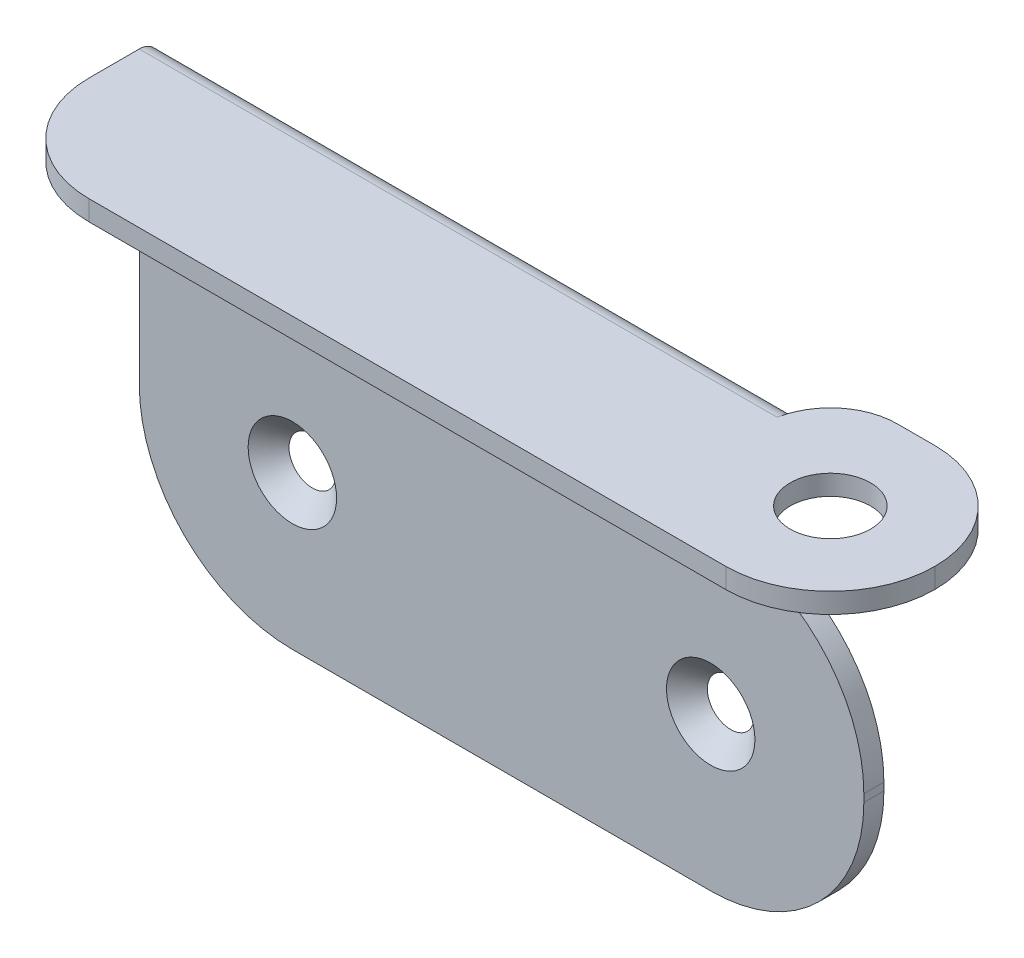
ISO-10303-21;
HEADER;
FILE_DESCRIPTION(('STEP AP214'),'2;1');
FILE_NAME('part.step','',(''),(''),'','','');
FILE_SCHEMA(('AUTOMOTIVE_DESIGN { 1 0 10303 214 1 1 1 1 }'));
ENDSEC;
DATA;
#1=APPLICATION_CONTEXT('core data for automotive mechanical design processes');
#2=APPLICATION_PROTOCOL_DEFINITION('international standard','automotive_design',2000,#1);
#3=PRODUCT_CONTEXT('',#1,'mechanical');
#4=PRODUCT('Part','Part','',(#3));
#5=PRODUCT_RELATED_PRODUCT_CATEGORY('part','',(#4));
#6=PRODUCT_DEFINITION_FORMATION('','',#4);
#7=PRODUCT_DEFINITION_CONTEXT('part definition',#1,'design');
#8=PRODUCT_DEFINITION('design','',#6,#7);
#9=PRODUCT_DEFINITION_SHAPE('','',#8);
#10=(LENGTH_UNIT() NAMED_UNIT(*) SI_UNIT(.MILLI.,.METRE.));
#11=(NAMED_UNIT(*) PLANE_ANGLE_UNIT() SI_UNIT($,.RADIAN.));
#12=(NAMED_UNIT(*) SI_UNIT($,.STERADIAN.) SOLID_ANGLE_UNIT());
#13=UNCERTAINTY_MEASURE_WITH_UNIT(LENGTH_MEASURE(1.E-05),#10,'distance_accuracy_value','');
#14=(GEOMETRIC_REPRESENTATION_CONTEXT(3) GLOBAL_UNCERTAINTY_ASSIGNED_CONTEXT((#13)) GLOBAL_UNIT_ASSIGNED_CONTEXT((#10,
#11,#12)) REPRESENTATION_CONTEXT('',''));
#15=CARTESIAN_POINT('',(0.,0.,0.));
#16=DIRECTION('',(0.,0.,1.));
#17=DIRECTION('',(1.,0.,0.));
#18=AXIS2_PLACEMENT_3D('',#15,#16,#17);
#19=CARTESIAN_POINT('',(0.,0.,0.));
#20=DIRECTION('',(0.,0.,1.));
#21=DIRECTION('',(1.,0.,0.));
#22=AXIS2_PLACEMENT_3D('',#19,#20,#21);
#23=PLANE('',#22);
#24=CARTESIAN_POINT('',(-15.875,0.,0.));
#25=DIRECTION('',(0.,0.,-1.));
#26=DIRECTION('',(-1.,0.,0.));
#27=AXIS2_PLACEMENT_3D('',#24,#25,#26);
#28=CIRCLE('',#27,1.778);
#29=CARTESIAN_POINT('',(-17.653,0.,0.));
#30=VERTEX_POINT('',#29);
#31=EDGE_CURVE('E406',#30,#30,#28,.T.);
#32=ORIENTED_EDGE('',*,*,#31,.F.);
#33=EDGE_LOOP('',(#32));
#34=FACE_BOUND('',#33,.T.);
#35=CARTESIAN_POINT('',(15.875,0.,0.));
#36=DIRECTION('',(0.,0.,-1.));
#37=DIRECTION('',(-1.,0.,0.));
#38=AXIS2_PLACEMENT_3D('',#35,#36,#37);
#39=CIRCLE('',#38,1.778);
#40=CARTESIAN_POINT('',(14.097,0.,0.));
#41=VERTEX_POINT('',#40);
#42=EDGE_CURVE('E413',#41,#41,#39,.T.);
#43=ORIENTED_EDGE('',*,*,#42,.F.);
#44=EDGE_LOOP('',(#43));
#45=FACE_BOUND('',#44,.T.);
#46=DIRECTION('',(0.,-1.,0.));
#47=VECTOR('',#46,1.);
#48=CARTESIAN_POINT('',(-27.4955,7.42949999999999,0.));
#49=LINE('',#48,#47);
#50=CARTESIAN_POINT('',(-27.4955,20.5105,0.));
#51=VERTEX_POINT('',#50);
#52=CARTESIAN_POINT('',(-27.4955,0.,0.));
#53=VERTEX_POINT('',#52);
#54=EDGE_CURVE('E212',#51,#53,#49,.T.);
#55=ORIENTED_EDGE('',*,*,#54,.F.);
#56=DIRECTION('',(-1.,0.,0.));
#57=VECTOR('',#56,1.);
#58=CARTESIAN_POINT('',(0.,20.5105,0.));
#59=LINE('',#58,#57);
#60=CARTESIAN_POINT('',(19.8755,20.5105,0.));
#61=VERTEX_POINT('',#60);
#62=EDGE_CURVE('E373',#51,#61,#59,.F.);
#63=ORIENTED_EDGE('',*,*,#62,.T.);
#64=CARTESIAN_POINT('',(19.8755,17.9705,0.));
#65=DIRECTION('',(0.,0.,-1.));
#66=DIRECTION('',(-1.,0.,0.));
#67=AXIS2_PLACEMENT_3D('',#64,#65,#66);
#68=CIRCLE('',#67,2.54);
#69=CARTESIAN_POINT('',(17.3355,17.9705,0.));
#70=VERTEX_POINT('',#69);
#71=EDGE_CURVE('E187',#70,#61,#68,.T.);
#72=ORIENTED_EDGE('',*,*,#71,.F.);
#73=DIRECTION('',(0.,1.,0.));
#74=VECTOR('',#73,1.);
#75=CARTESIAN_POINT('',(17.3355,14.1605,0.));
#76=LINE('',#75,#74);
#77=CARTESIAN_POINT('',(17.3355,14.1605,0.));
#78=VERTEX_POINT('',#77);
#79=EDGE_CURVE('E173',#78,#70,#76,.T.);
#80=ORIENTED_EDGE('',*,*,#79,.F.);
#81=CARTESIAN_POINT('',(19.8755,14.1605,0.));
#82=DIRECTION('',(0.,0.,-1.));
#83=DIRECTION('',(-1.,0.,0.));
#84=AXIS2_PLACEMENT_3D('',#81,#82,#83);
#85=CIRCLE('',#84,2.54);
#86=CARTESIAN_POINT('',(19.1579215246637,11.7239694478144,0.));
#87=VERTEX_POINT('',#86);
#88=EDGE_CURVE('E163',#87,#78,#85,.T.);
#89=ORIENTED_EDGE('',*,*,#88,.F.);
#90=CARTESIAN_POINT('',(15.875,0.576842171565131,0.));
#91=DIRECTION('',(0.,0.,1.));
#92=DIRECTION('',(1.,0.,0.));
#93=AXIS2_PLACEMENT_3D('',#90,#91,#92);
#94=CIRCLE('',#93,11.6205);
#95=CARTESIAN_POINT('',(27.4955,0.576842171565131,0.));
#96=VERTEX_POINT('',#95);
#97=EDGE_CURVE('E255',#87,#96,#94,.F.);
#98=ORIENTED_EDGE('',*,*,#97,.T.);
#99=DIRECTION('',(0.,1.,0.));
#100=VECTOR('',#99,1.);
#101=CARTESIAN_POINT('',(27.4955,11.6205,0.));
#102=LINE('',#101,#100);
#103=CARTESIAN_POINT('',(27.4955,0.,0.));
#104=VERTEX_POINT('',#103);
#105=EDGE_CURVE('E216',#104,#96,#102,.T.);
#106=ORIENTED_EDGE('',*,*,#105,.F.);
#107=CARTESIAN_POINT('',(15.875,0.,0.));
#108=DIRECTION('',(0.,0.,1.));
#109=DIRECTION('',(1.,0.,0.));
#110=AXIS2_PLACEMENT_3D('',#107,#108,#109);
#111=CIRCLE('',#110,11.6205);
#112=CARTESIAN_POINT('',(15.875,-11.6205,0.));
#113=VERTEX_POINT('',#112);
#114=EDGE_CURVE('E244',#104,#113,#111,.F.);
#115=ORIENTED_EDGE('',*,*,#114,.T.);
#116=DIRECTION('',(1.,0.,0.));
#117=VECTOR('',#116,1.);
#118=CARTESIAN_POINT('',(-27.4955,-11.6205,0.));
#119=LINE('',#118,#117);
#120=CARTESIAN_POINT('',(-15.875,-11.6205,0.));
#121=VERTEX_POINT('',#120);
#122=EDGE_CURVE('E223',#121,#113,#119,.T.);
#123=ORIENTED_EDGE('',*,*,#122,.F.);
#124=CARTESIAN_POINT('',(-15.875,0.,0.));
#125=DIRECTION('',(0.,0.,1.));
#126=DIRECTION('',(1.,0.,0.));
#127=AXIS2_PLACEMENT_3D('',#124,#125,#126);
#128=CIRCLE('',#127,11.6205);
#129=EDGE_CURVE('E257',#121,#53,#128,.F.);
#130=ORIENTED_EDGE('',*,*,#129,.T.);
#131=EDGE_LOOP('',(#55,#63,#72,#80,#89,#98,#106,#115,#123,#130));
#132=FACE_BOUND('',#131,.T.);
#133=ADVANCED_FACE('F33',(#34,#45,#132),#23,.F.);
#134=CARTESIAN_POINT('',(0.,0.,1.524));
#135=DIRECTION('',(0.,0.,1.));
#136=DIRECTION('',(1.,0.,0.));
#137=AXIS2_PLACEMENT_3D('',#134,#135,#136);
#138=PLANE('',#137);
#139=CARTESIAN_POINT('',(15.875,0.,1.524));
#140=DIRECTION('',(0.,0.,1.));
#141=DIRECTION('',(1.,0.,0.));
#142=AXIS2_PLACEMENT_3D('',#139,#140,#141);
#143=CIRCLE('',#142,3.35614819821684);
#144=CARTESIAN_POINT('',(19.2311481982168,0.,1.524));
#145=VERTEX_POINT('',#144);
#146=EDGE_CURVE('E421',#145,#145,#143,.T.);
#147=ORIENTED_EDGE('',*,*,#146,.F.);
#148=EDGE_LOOP('',(#147));
#149=FACE_BOUND('',#148,.T.);
#150=CARTESIAN_POINT('',(-15.875,0.,1.524));
#151=DIRECTION('',(0.,0.,1.));
#152=DIRECTION('',(1.,0.,0.));
#153=AXIS2_PLACEMENT_3D('',#150,#151,#152);
#154=CIRCLE('',#153,3.35614819821683);
#155=CARTESIAN_POINT('',(-12.5188518017832,0.,1.524));
#156=VERTEX_POINT('',#155);
#157=EDGE_CURVE('E416',#156,#156,#154,.T.);
#158=ORIENTED_EDGE('',*,*,#157,.F.);
#159=EDGE_LOOP('',(#158));
#160=FACE_BOUND('',#159,.T.);
#161=CARTESIAN_POINT('',(19.8755,17.9705,1.524));
#162=DIRECTION('',(0.,0.,1.));
#163=DIRECTION('',(1.,0.,0.));
#164=AXIS2_PLACEMENT_3D('',#161,#162,#163);
#165=CIRCLE('',#164,2.54);
#166=CARTESIAN_POINT('',(17.5475515469624,18.9865,1.524));
#167=VERTEX_POINT('',#166);
#168=CARTESIAN_POINT('',(17.3355,17.9705,1.524));
#169=VERTEX_POINT('',#168);
#170=EDGE_CURVE('E195',#167,#169,#165,.T.);
#171=ORIENTED_EDGE('',*,*,#170,.F.);
#172=DIRECTION('',(1.,0.,0.));
#173=VECTOR('',#172,1.);
#174=CARTESIAN_POINT('',(0.,18.9865,1.524));
#175=LINE('',#174,#173);
#176=CARTESIAN_POINT('',(-27.4955,18.9865,1.524));
#177=VERTEX_POINT('',#176);
#178=EDGE_CURVE('E273',#167,#177,#175,.F.);
#179=ORIENTED_EDGE('',*,*,#178,.T.);
#180=DIRECTION('',(0.,-1.,0.));
#181=VECTOR('',#180,1.);
#182=CARTESIAN_POINT('',(-27.4955,22.0345,1.524));
#183=LINE('',#182,#181);
#184=CARTESIAN_POINT('',(-27.4955,0.,1.524));
#185=VERTEX_POINT('',#184);
#186=EDGE_CURVE('E213',#177,#185,#183,.T.);
#187=ORIENTED_EDGE('',*,*,#186,.T.);
#188=CARTESIAN_POINT('',(-15.875,0.,1.524));
#189=DIRECTION('',(0.,0.,1.));
#190=DIRECTION('',(1.,0.,0.));
#191=AXIS2_PLACEMENT_3D('',#188,#189,#190);
#192=CIRCLE('',#191,11.6205);
#193=CARTESIAN_POINT('',(-15.875,-11.6205,1.524));
#194=VERTEX_POINT('',#193);
#195=EDGE_CURVE('E265',#185,#194,#192,.T.);
#196=ORIENTED_EDGE('',*,*,#195,.T.);
#197=DIRECTION('',(1.,0.,0.));
#198=VECTOR('',#197,1.);
#199=CARTESIAN_POINT('',(-27.4955,-11.6205,1.524));
#200=LINE('',#199,#198);
#201=CARTESIAN_POINT('',(15.875,-11.6205,1.524));
#202=VERTEX_POINT('',#201);
#203=EDGE_CURVE('E215',#194,#202,#200,.T.);
#204=ORIENTED_EDGE('',*,*,#203,.T.);
#205=CARTESIAN_POINT('',(15.875,0.,1.524));
#206=DIRECTION('',(0.,0.,1.));
#207=DIRECTION('',(1.,0.,0.));
#208=AXIS2_PLACEMENT_3D('',#205,#206,#207);
#209=CIRCLE('',#208,11.6205);
#210=CARTESIAN_POINT('',(27.4955,0.,1.524));
#211=VERTEX_POINT('',#210);
#212=EDGE_CURVE('E250',#202,#211,#209,.T.);
#213=ORIENTED_EDGE('',*,*,#212,.T.);
#214=DIRECTION('',(0.,1.,0.));
#215=VECTOR('',#214,1.);
#216=CARTESIAN_POINT('',(27.4955,11.6205,1.524));
#217=LINE('',#216,#215);
#218=CARTESIAN_POINT('',(27.4955,0.576842171565131,1.524));
#219=VERTEX_POINT('',#218);
#220=EDGE_CURVE('E218',#211,#219,#217,.T.);
#221=ORIENTED_EDGE('',*,*,#220,.T.);
#222=CARTESIAN_POINT('',(15.875,0.576842171565131,1.524));
#223=DIRECTION('',(0.,0.,1.));
#224=DIRECTION('',(1.,0.,0.));
#225=AXIS2_PLACEMENT_3D('',#222,#223,#224);
#226=CIRCLE('',#225,11.6205);
#227=CARTESIAN_POINT('',(19.1579215246637,11.7239694478144,1.524));
#228=VERTEX_POINT('',#227);
#229=EDGE_CURVE('E263',#219,#228,#226,.T.);
#230=ORIENTED_EDGE('',*,*,#229,.T.);
#231=CARTESIAN_POINT('',(19.8755,14.1605,1.524));
#232=DIRECTION('',(0.,0.,1.));
#233=DIRECTION('',(1.,0.,0.));
#234=AXIS2_PLACEMENT_3D('',#231,#232,#233);
#235=CIRCLE('',#234,2.54);
#236=CARTESIAN_POINT('',(17.3355,14.1605,1.524));
#237=VERTEX_POINT('',#236);
#238=EDGE_CURVE('E198',#237,#228,#235,.T.);
#239=ORIENTED_EDGE('',*,*,#238,.F.);
#240=DIRECTION('',(0.,-1.,0.));
#241=VECTOR('',#240,1.);
#242=CARTESIAN_POINT('',(17.3355,0.,1.524));
#243=LINE('',#242,#241);
#244=EDGE_CURVE('E182',#169,#237,#243,.T.);
#245=ORIENTED_EDGE('',*,*,#244,.F.);
#246=EDGE_LOOP('',(#171,#179,#187,#196,#204,#213,#221,#230,#239,#245));
#247=FACE_BOUND('',#246,.T.);
#248=ADVANCED_FACE('F314',(#149,#160,#247),#138,.T.);
#249=CARTESIAN_POINT('',(36.703,22.0345,1.524));
#250=DIRECTION('',(0.,-1.,0.));
#251=DIRECTION('',(1.,0.,0.));
#252=AXIS2_PLACEMENT_3D('',#249,#250,#251);
#253=PLANE('',#252);
#254=CARTESIAN_POINT('',(25.908,22.0345,2.4765));
#255=DIRECTION('',(0.,-1.,0.));
#256=DIRECTION('',(1.,0.,0.));
#257=AXIS2_PLACEMENT_3D('',#254,#255,#256);
#258=CIRCLE('',#257,5.08);
#259=CARTESIAN_POINT('',(25.908,22.0345,-2.6035));
#260=VERTEX_POINT('',#259);
#261=CARTESIAN_POINT('',(20.9180958175532,22.0345,1.524));
#262=VERTEX_POINT('',#261);
#263=EDGE_CURVE('E392',#260,#262,#258,.F.);
#264=ORIENTED_EDGE('',*,*,#263,.T.);
#265=DIRECTION('',(-1.,0.,0.));
#266=VECTOR('',#265,1.);
#267=CARTESIAN_POINT('',(36.703,22.0345,1.524));
#268=LINE('',#267,#266);
#269=CARTESIAN_POINT('',(-27.4955,22.0345,1.524));
#270=VERTEX_POINT('',#269);
#271=EDGE_CURVE('E381',#262,#270,#268,.T.);
#272=ORIENTED_EDGE('',*,*,#271,.T.);
#273=DIRECTION('',(0.,0.,-1.));
#274=VECTOR('',#273,1.);
#275=CARTESIAN_POINT('',(-27.4955,22.0345,1.524));
#276=LINE('',#275,#274);
#277=CARTESIAN_POINT('',(-27.4955,22.0345,5.334));
#278=VERTEX_POINT('',#277);
#279=EDGE_CURVE('E221',#278,#270,#276,.T.);
#280=ORIENTED_EDGE('',*,*,#279,.F.);
#281=CARTESIAN_POINT('',(-19.558,22.0345,5.334));
#282=DIRECTION('',(0.,-1.,0.));
#283=DIRECTION('',(1.,0.,0.));
#284=AXIS2_PLACEMENT_3D('',#281,#282,#283);
#285=CIRCLE('',#284,7.9375);
#286=CARTESIAN_POINT('',(-19.558,22.0345,13.2715));
#287=VERTEX_POINT('',#286);
#288=EDGE_CURVE('E433',#278,#287,#285,.F.);
#289=ORIENTED_EDGE('',*,*,#288,.T.);
#290=DIRECTION('',(-1.,0.,0.));
#291=VECTOR('',#290,1.);
#292=CARTESIAN_POINT('',(36.703,22.0345,13.2715));
#293=LINE('',#292,#291);
#294=CARTESIAN_POINT('',(28.7655,22.0345,13.2715));
#295=VERTEX_POINT('',#294);
#296=EDGE_CURVE('E207',#295,#287,#293,.T.);
#297=ORIENTED_EDGE('',*,*,#296,.F.);
#298=CARTESIAN_POINT('',(28.7655,22.0345,5.334));
#299=DIRECTION('',(0.,-1.,0.));
#300=DIRECTION('',(1.,0.,0.));
#301=AXIS2_PLACEMENT_3D('',#298,#299,#300);
#302=CIRCLE('',#301,7.9375);
#303=CARTESIAN_POINT('',(36.703,22.0345,5.334));
#304=VERTEX_POINT('',#303);
#305=EDGE_CURVE('E232',#295,#304,#302,.F.);
#306=ORIENTED_EDGE('',*,*,#305,.T.);
#307=CARTESIAN_POINT('',(28.7655,22.0345,5.334));
#308=DIRECTION('',(0.,-1.,0.));
#309=DIRECTION('',(1.,0.,0.));
#310=AXIS2_PLACEMENT_3D('',#307,#308,#309);
#311=CIRCLE('',#310,7.9375);
#312=CARTESIAN_POINT('',(28.7655,22.0345,-2.6035));
#313=VERTEX_POINT('',#312);
#314=EDGE_CURVE('E377',#304,#313,#311,.F.);
#315=ORIENTED_EDGE('',*,*,#314,.T.);
#316=DIRECTION('',(-1.,0.,0.));
#317=VECTOR('',#316,1.);
#318=CARTESIAN_POINT('',(36.703,22.0345,-2.6035));
#319=LINE('',#318,#317);
#320=EDGE_CURVE('E407',#313,#260,#319,.T.);
#321=ORIENTED_EDGE('',*,*,#320,.T.);
#322=EDGE_LOOP('',(#264,#272,#280,#289,#297,#306,#315,#321));
#323=FACE_BOUND('',#322,.T.);
#324=CARTESIAN_POINT('',(28.7655,22.0345,5.334));
#325=DIRECTION('',(0.,-1.,0.));
#326=DIRECTION('',(1.,0.,0.));
#327=AXIS2_PLACEMENT_3D('',#324,#325,#326);
#328=CIRCLE('',#327,3.048);
#329=CARTESIAN_POINT('',(31.8135,22.0345,5.334));
#330=VERTEX_POINT('',#329);
#331=EDGE_CURVE('E204',#330,#330,#328,.T.);
#332=ORIENTED_EDGE('',*,*,#331,.T.);
#333=EDGE_LOOP('',(#332));
#334=FACE_BOUND('',#333,.T.);
#335=ADVANCED_FACE('F317',(#323,#334),#253,.F.);
#336=CARTESIAN_POINT('',(-27.4955,7.42949999999999,1.524));
#337=DIRECTION('',(1.,0.,0.));
#338=DIRECTION('',(0.,1.,0.));
#339=AXIS2_PLACEMENT_3D('',#336,#337,#338);
#340=PLANE('',#339);
#341=ORIENTED_EDGE('',*,*,#279,.T.);
#342=CARTESIAN_POINT('',(-27.4955,20.5105,1.524));
#343=DIRECTION('',(1.,0.,0.));
#344=DIRECTION('',(0.,1.,0.));
#345=AXIS2_PLACEMENT_3D('',#342,#343,#344);
#346=CIRCLE('',#345,1.524);
#347=EDGE_CURVE('E371',#270,#51,#346,.F.);
#348=ORIENTED_EDGE('',*,*,#347,.T.);
#349=ORIENTED_EDGE('',*,*,#54,.T.);
#350=DIRECTION('',(0.,0.,-1.));
#351=VECTOR('',#350,1.);
#352=CARTESIAN_POINT('',(-27.4955,0.,1.524));
#353=LINE('',#352,#351);
#354=EDGE_CURVE('E260',#53,#185,#353,.F.);
#355=ORIENTED_EDGE('',*,*,#354,.T.);
#356=ORIENTED_EDGE('',*,*,#186,.F.);
#357=CARTESIAN_POINT('',(-27.4955,18.9865,3.048));
#358=DIRECTION('',(1.,0.,0.));
#359=DIRECTION('',(0.,1.,0.));
#360=AXIS2_PLACEMENT_3D('',#357,#358,#359);
#361=CIRCLE('',#360,1.524);
#362=CARTESIAN_POINT('',(-27.4955,20.5105,3.04800000000002));
#363=VERTEX_POINT('',#362);
#364=EDGE_CURVE('E282',#177,#363,#361,.T.);
#365=ORIENTED_EDGE('',*,*,#364,.T.);
#366=DIRECTION('',(0.,0.,-1.));
#367=VECTOR('',#366,1.);
#368=CARTESIAN_POINT('',(-27.4955,20.5105,58.4457141962647));
#369=LINE('',#368,#367);
#370=CARTESIAN_POINT('',(-27.4955,20.5105,5.33400000000001));
#371=VERTEX_POINT('',#370);
#372=EDGE_CURVE('E174',#371,#363,#369,.T.);
#373=ORIENTED_EDGE('',*,*,#372,.F.);
#374=DIRECTION('',(0.,1.,0.));
#375=VECTOR('',#374,1.);
#376=CARTESIAN_POINT('',(-27.4955,7.42949999999999,5.334));
#377=LINE('',#376,#375);
#378=EDGE_CURVE('E431',#371,#278,#377,.T.);
#379=ORIENTED_EDGE('',*,*,#378,.T.);
#380=EDGE_LOOP('',(#341,#348,#349,#355,#356,#365,#373,#379));
#381=FACE_BOUND('',#380,.T.);
#382=ADVANCED_FACE('F328',(#381),#340,.F.);
#383=CARTESIAN_POINT('',(-27.4955,-11.6205,1.524));
#384=DIRECTION('',(0.,1.,0.));
#385=DIRECTION('',(0.,0.,1.));
#386=AXIS2_PLACEMENT_3D('',#383,#384,#385);
#387=PLANE('',#386);
#388=ORIENTED_EDGE('',*,*,#203,.F.);
#389=DIRECTION('',(0.,0.,-1.));
#390=VECTOR('',#389,1.);
#391=CARTESIAN_POINT('',(-15.875,-11.6205,1.524));
#392=LINE('',#391,#390);
#393=EDGE_CURVE('E252',#194,#121,#392,.T.);
#394=ORIENTED_EDGE('',*,*,#393,.T.);
#395=ORIENTED_EDGE('',*,*,#122,.T.);
#396=DIRECTION('',(0.,0.,-1.));
#397=VECTOR('',#396,1.);
#398=CARTESIAN_POINT('',(15.875,-11.6205,1.524));
#399=LINE('',#398,#397);
#400=EDGE_CURVE('E247',#113,#202,#399,.F.);
#401=ORIENTED_EDGE('',*,*,#400,.T.);
#402=EDGE_LOOP('',(#388,#394,#395,#401));
#403=FACE_BOUND('',#402,.T.);
#404=ADVANCED_FACE('F324',(#403),#387,.F.);
#405=CARTESIAN_POINT('',(27.4955,11.6205,1.524));
#406=DIRECTION('',(-1.,0.,0.));
#407=DIRECTION('',(0.,0.,1.));
#408=AXIS2_PLACEMENT_3D('',#405,#406,#407);
#409=PLANE('',#408);
#410=ORIENTED_EDGE('',*,*,#105,.T.);
#411=DIRECTION('',(0.,0.,-1.));
#412=VECTOR('',#411,1.);
#413=CARTESIAN_POINT('',(27.4955,0.576842171565131,1.524));
#414=LINE('',#413,#412);
#415=EDGE_CURVE('E268',#96,#219,#414,.F.);
#416=ORIENTED_EDGE('',*,*,#415,.T.);
#417=ORIENTED_EDGE('',*,*,#220,.F.);
#418=DIRECTION('',(0.,0.,-1.));
#419=VECTOR('',#418,1.);
#420=CARTESIAN_POINT('',(27.4955,0.,1.524));
#421=LINE('',#420,#419);
#422=EDGE_CURVE('E241',#211,#104,#421,.T.);
#423=ORIENTED_EDGE('',*,*,#422,.T.);
#424=EDGE_LOOP('',(#410,#416,#417,#423));
#425=FACE_BOUND('',#424,.T.);
#426=ADVANCED_FACE('F312',(#425),#409,.F.);
#427=CARTESIAN_POINT('',(36.703,20.5105,13.2715));
#428=DIRECTION('',(0.,1.,0.));
#429=DIRECTION('',(-1.,0.,0.));
#430=AXIS2_PLACEMENT_3D('',#427,#428,#429);
#431=PLANE('',#430);
#432=CARTESIAN_POINT('',(28.7655,20.5105,5.334));
#433=DIRECTION('',(0.,-1.,0.));
#434=DIRECTION('',(1.,0.,0.));
#435=AXIS2_PLACEMENT_3D('',#432,#433,#434);
#436=CIRCLE('',#435,3.048);
#437=CARTESIAN_POINT('',(31.8135,20.5105,5.334));
#438=VERTEX_POINT('',#437);
#439=EDGE_CURVE('E201',#438,#438,#436,.T.);
#440=ORIENTED_EDGE('',*,*,#439,.F.);
#441=EDGE_LOOP('',(#440));
#442=FACE_BOUND('',#441,.T.);
#443=DIRECTION('',(1.,0.,0.));
#444=VECTOR('',#443,1.);
#445=CARTESIAN_POINT('',(19.8755,20.5105,0.));
#446=LINE('',#445,#444);
#447=CARTESIAN_POINT('',(21.4725352272845,20.5105,0.));
#448=VERTEX_POINT('',#447);
#449=EDGE_CURVE('E53',#61,#448,#446,.T.);
#450=ORIENTED_EDGE('',*,*,#449,.T.);
#451=CARTESIAN_POINT('',(25.908,20.5105,2.4765));
#452=DIRECTION('',(0.,1.,0.));
#453=DIRECTION('',(-1.,0.,0.));
#454=AXIS2_PLACEMENT_3D('',#451,#452,#453);
#455=CIRCLE('',#454,5.08);
#456=CARTESIAN_POINT('',(25.908,20.5105,-2.6035));
#457=VERTEX_POINT('',#456);
#458=EDGE_CURVE('E47',#448,#457,#455,.F.);
#459=ORIENTED_EDGE('',*,*,#458,.T.);
#460=DIRECTION('',(1.,0.,0.));
#461=VECTOR('',#460,1.);
#462=CARTESIAN_POINT('',(36.703,20.5105,-2.6035));
#463=LINE('',#462,#461);
#464=CARTESIAN_POINT('',(28.7655,20.5105,-2.6035));
#465=VERTEX_POINT('',#464);
#466=EDGE_CURVE('E396',#457,#465,#463,.T.);
#467=ORIENTED_EDGE('',*,*,#466,.T.);
#468=CARTESIAN_POINT('',(28.7655,20.5105,5.334));
#469=DIRECTION('',(0.,1.,0.));
#470=DIRECTION('',(-1.,0.,0.));
#471=AXIS2_PLACEMENT_3D('',#468,#469,#470);
#472=CIRCLE('',#471,7.9375);
#473=CARTESIAN_POINT('',(36.703,20.5105,5.334));
#474=VERTEX_POINT('',#473);
#475=EDGE_CURVE('E387',#465,#474,#472,.F.);
#476=ORIENTED_EDGE('',*,*,#475,.T.);
#477=CARTESIAN_POINT('',(28.7655,20.5105,5.334));
#478=DIRECTION('',(0.,1.,0.));
#479=DIRECTION('',(-1.,0.,0.));
#480=AXIS2_PLACEMENT_3D('',#477,#478,#479);
#481=CIRCLE('',#480,7.9375);
#482=CARTESIAN_POINT('',(28.7655,20.5105,13.2715));
#483=VERTEX_POINT('',#482);
#484=EDGE_CURVE('E238',#474,#483,#481,.F.);
#485=ORIENTED_EDGE('',*,*,#484,.T.);
#486=DIRECTION('',(1.,0.,0.));
#487=VECTOR('',#486,1.);
#488=CARTESIAN_POINT('',(36.703,20.5105,13.2715));
#489=LINE('',#488,#487);
#490=CARTESIAN_POINT('',(-19.558,20.5105,13.2715));
#491=VERTEX_POINT('',#490);
#492=EDGE_CURVE('E210',#491,#483,#489,.T.);
#493=ORIENTED_EDGE('',*,*,#492,.F.);
#494=CARTESIAN_POINT('',(-19.558,20.5105,5.334));
#495=DIRECTION('',(0.,1.,0.));
#496=DIRECTION('',(-1.,0.,0.));
#497=AXIS2_PLACEMENT_3D('',#494,#495,#496);
#498=CIRCLE('',#497,7.9375);
#499=EDGE_CURVE('E427',#491,#371,#498,.F.);
#500=ORIENTED_EDGE('',*,*,#499,.T.);
#501=ORIENTED_EDGE('',*,*,#372,.T.);
#502=DIRECTION('',(1.,0.,0.));
#503=VECTOR('',#502,1.);
#504=CARTESIAN_POINT('',(36.703,20.5105,3.048));
#505=LINE('',#504,#503);
#506=CARTESIAN_POINT('',(19.8755,20.5105,3.048));
#507=VERTEX_POINT('',#506);
#508=EDGE_CURVE('E270',#363,#507,#505,.T.);
#509=ORIENTED_EDGE('',*,*,#508,.T.);
#510=DIRECTION('',(0.,0.,-1.));
#511=VECTOR('',#510,1.);
#512=CARTESIAN_POINT('',(19.8755,20.5105,13.9446));
#513=LINE('',#512,#511);
#514=EDGE_CURVE('E193',#507,#61,#513,.T.);
#515=ORIENTED_EDGE('',*,*,#514,.T.);
#516=EDGE_LOOP('',(#450,#459,#467,#476,#485,#493,#500,#501,#509,#515));
#517=FACE_BOUND('',#516,.T.);
#518=ADVANCED_FACE('F308',(#442,#517),#431,.F.);
#519=CARTESIAN_POINT('',(0.,0.,13.2715));
#520=DIRECTION('',(0.,0.,-1.));
#521=DIRECTION('',(-1.,0.,0.));
#522=AXIS2_PLACEMENT_3D('',#519,#520,#521);
#523=PLANE('',#522);
#524=ORIENTED_EDGE('',*,*,#296,.T.);
#525=DIRECTION('',(0.,1.,0.));
#526=VECTOR('',#525,1.);
#527=CARTESIAN_POINT('',(-19.558,0.,13.2715));
#528=LINE('',#527,#526);
#529=EDGE_CURVE('E434',#287,#491,#528,.F.);
#530=ORIENTED_EDGE('',*,*,#529,.T.);
#531=ORIENTED_EDGE('',*,*,#492,.T.);
#532=DIRECTION('',(0.,1.,0.));
#533=VECTOR('',#532,1.);
#534=CARTESIAN_POINT('',(28.7655,0.,13.2715));
#535=LINE('',#534,#533);
#536=EDGE_CURVE('E229',#483,#295,#535,.T.);
#537=ORIENTED_EDGE('',*,*,#536,.T.);
#538=EDGE_LOOP('',(#524,#530,#531,#537));
#539=FACE_BOUND('',#538,.T.);
#540=ADVANCED_FACE('F304',(#539),#523,.F.);
#541=CARTESIAN_POINT('',(28.7655,34.4551,5.334));
#542=DIRECTION('',(0.,-1.,0.));
#543=DIRECTION('',(1.,0.,0.));
#544=AXIS2_PLACEMENT_3D('',#541,#542,#543);
#545=CYLINDRICAL_SURFACE('',#544,3.048);
#546=ORIENTED_EDGE('',*,*,#439,.T.);
#547=EDGE_LOOP('',(#546));
#548=FACE_BOUND('',#547,.T.);
#549=ORIENTED_EDGE('',*,*,#331,.F.);
#550=EDGE_LOOP('',(#549));
#551=FACE_BOUND('',#550,.T.);
#552=ADVANCED_FACE('F293',(#548,#551),#545,.F.);
#553=CARTESIAN_POINT('',(19.8755,17.9705,13.9446));
#554=DIRECTION('',(0.,0.,-1.));
#555=DIRECTION('',(-1.,0.,0.));
#556=AXIS2_PLACEMENT_3D('',#553,#554,#555);
#557=CYLINDRICAL_SURFACE('',#556,2.54);
#558=ORIENTED_EDGE('',*,*,#514,.F.);
#559=CARTESIAN_POINT('',(17.5475515469624,18.9865,1.524));
#560=CARTESIAN_POINT('',(17.5672472654258,19.0316560186973,1.52399513726266));
#561=CARTESIAN_POINT('',(17.5882635824378,19.0762009042753,1.52600611045439));
#562=CARTESIAN_POINT('',(17.6326650253971,19.1636799619868,1.53370032251843));
#563=CARTESIAN_POINT('',(17.6560462214487,19.206616648986,1.53937755078635));
#564=CARTESIAN_POINT('',(17.7047216867703,19.2902124424946,1.55397241371087));
#565=CARTESIAN_POINT('',(17.7299940300148,19.3308903015169,1.56285643351122));
#566=CARTESIAN_POINT('',(17.7824234208108,19.4102557621123,1.58352399332433));
#567=CARTESIAN_POINT('',(17.8095814324554,19.4489423277247,1.59530902450307));
#568=CARTESIAN_POINT('',(17.908166900425,19.5814487964071,1.64133837352595));
#569=CARTESIAN_POINT('',(17.9841019026707,19.6696309719166,1.68248005272117));
#570=CARTESIAN_POINT('',(18.143637241959,19.8320405497228,1.77657704561547));
#571=CARTESIAN_POINT('',(18.2272735150868,19.9061970297805,1.82958958669633));
#572=CARTESIAN_POINT('',(18.4340914753251,20.0674746395878,1.96666022709575));
#573=CARTESIAN_POINT('',(18.5597695039215,20.1480185412213,2.05467936445942));
#574=CARTESIAN_POINT('',(18.8170816067228,20.2840634114614,2.24042642209682));
#575=CARTESIAN_POINT('',(18.9487198772019,20.3395464246954,2.33816124239021));
#576=CARTESIAN_POINT('',(19.2110376093122,20.4258051755872,2.53591831848904));
#577=CARTESIAN_POINT('',(19.3416113727465,20.457319196621,2.63576548761217));
#578=CARTESIAN_POINT('',(19.6040114748552,20.4994327681697,2.83771680637285));
#579=CARTESIAN_POINT('',(19.7358347343988,20.5100746256235,2.93981596538622));
#580=CARTESIAN_POINT('',(19.8701875931688,20.5104958275255,3.04388502819377));
#581=CARTESIAN_POINT('',(19.8728438259765,20.5104999937549,3.04594253731352));
#582=CARTESIAN_POINT('',(19.8755,20.5105,3.048));
#583=B_SPLINE_CURVE_WITH_KNOTS('',3,(#559,#560,#561,#562,#563,#564,#565,#566,#567,#568,#569,
#570,#571,#572,#573,#574,#575,#576,#577,#578,#579,#580,#581,#582),.UNSPECIFIED.,.F.,.F.,(4,2,2,
2,2,2,2,2,2,2,2,4),(0.,0.147683787486705,0.295126068856728,0.441065666746934,0.587080437128706,
0.955175378640923,1.32508457997396,1.84214113393,2.35956755800387,2.86032707039096,
3.36007051242266,3.37015020270813),.UNSPECIFIED.);
#584=EDGE_CURVE('E275',#507,#167,#583,.F.);
#585=ORIENTED_EDGE('',*,*,#584,.T.);
#586=ORIENTED_EDGE('',*,*,#170,.T.);
#587=DIRECTION('',(0.,0.,-1.));
#588=VECTOR('',#587,1.);
#589=CARTESIAN_POINT('',(17.3355,17.9705,13.9446));
#590=LINE('',#589,#588);
#591=EDGE_CURVE('E183',#169,#70,#590,.T.);
#592=ORIENTED_EDGE('',*,*,#591,.T.);
#593=ORIENTED_EDGE('',*,*,#71,.T.);
#594=EDGE_LOOP('',(#558,#585,#586,#592,#593));
#595=FACE_BOUND('',#594,.T.);
#596=ADVANCED_FACE('F288',(#595),#557,.F.);
#597=CARTESIAN_POINT('',(17.3355,14.1605,13.9446));
#598=DIRECTION('',(-1.,0.,0.));
#599=DIRECTION('',(0.,0.,1.));
#600=AXIS2_PLACEMENT_3D('',#597,#598,#599);
#601=PLANE('',#600);
#602=ORIENTED_EDGE('',*,*,#244,.T.);
#603=DIRECTION('',(0.,0.,-1.));
#604=VECTOR('',#603,1.);
#605=CARTESIAN_POINT('',(17.3355,14.1605,13.9446));
#606=LINE('',#605,#604);
#607=EDGE_CURVE('E167',#237,#78,#606,.T.);
#608=ORIENTED_EDGE('',*,*,#607,.T.);
#609=ORIENTED_EDGE('',*,*,#79,.T.);
#610=ORIENTED_EDGE('',*,*,#591,.F.);
#611=EDGE_LOOP('',(#602,#608,#609,#610));
#612=FACE_BOUND('',#611,.T.);
#613=ADVANCED_FACE('F178',(#612),#601,.F.);
#614=CARTESIAN_POINT('',(19.8755,14.1605,13.9446));
#615=DIRECTION('',(0.,0.,-1.));
#616=DIRECTION('',(-1.,0.,0.));
#617=AXIS2_PLACEMENT_3D('',#614,#615,#616);
#618=CYLINDRICAL_SURFACE('',#617,2.54);
#619=ORIENTED_EDGE('',*,*,#238,.T.);
#620=DIRECTION('',(0.,0.,-1.));
#621=VECTOR('',#620,1.);
#622=CARTESIAN_POINT('',(19.1579215246637,11.7239694478144,13.9446));
#623=LINE('',#622,#621);
#624=EDGE_CURVE('E170',#228,#87,#623,.T.);
#625=ORIENTED_EDGE('',*,*,#624,.T.);
#626=ORIENTED_EDGE('',*,*,#88,.T.);
#627=ORIENTED_EDGE('',*,*,#607,.F.);
#628=EDGE_LOOP('',(#619,#625,#626,#627));
#629=FACE_BOUND('',#628,.T.);
#630=ADVANCED_FACE('F166',(#629),#618,.F.);
#631=CARTESIAN_POINT('',(28.7655,0.,5.334));
#632=DIRECTION('',(0.,1.,0.));
#633=DIRECTION('',(0.,0.,1.));
#634=AXIS2_PLACEMENT_3D('',#631,#632,#633);
#635=CYLINDRICAL_SURFACE('',#634,7.9375);
#636=ORIENTED_EDGE('',*,*,#484,.F.);
#637=DIRECTION('',(0.,1.,0.));
#638=VECTOR('',#637,1.);
#639=CARTESIAN_POINT('',(36.703,20.5105,5.334));
#640=LINE('',#639,#638);
#641=EDGE_CURVE('E235',#304,#474,#640,.F.);
#642=ORIENTED_EDGE('',*,*,#641,.F.);
#643=ORIENTED_EDGE('',*,*,#305,.F.);
#644=ORIENTED_EDGE('',*,*,#536,.F.);
#645=EDGE_LOOP('',(#636,#642,#643,#644));
#646=FACE_BOUND('',#645,.T.);
#647=ADVANCED_FACE('F301',(#646),#635,.T.);
#648=CARTESIAN_POINT('',(15.875,0.,1.524));
#649=DIRECTION('',(0.,0.,-1.));
#650=DIRECTION('',(-1.,0.,0.));
#651=AXIS2_PLACEMENT_3D('',#648,#649,#650);
#652=CYLINDRICAL_SURFACE('',#651,11.6205);
#653=ORIENTED_EDGE('',*,*,#212,.F.);
#654=ORIENTED_EDGE('',*,*,#400,.F.);
#655=ORIENTED_EDGE('',*,*,#114,.F.);
#656=ORIENTED_EDGE('',*,*,#422,.F.);
#657=EDGE_LOOP('',(#653,#654,#655,#656));
#658=FACE_BOUND('',#657,.T.);
#659=ADVANCED_FACE('F338',(#658),#652,.T.);
#660=CARTESIAN_POINT('',(-15.875,0.,1.524));
#661=DIRECTION('',(0.,0.,-1.));
#662=DIRECTION('',(-1.,0.,0.));
#663=AXIS2_PLACEMENT_3D('',#660,#661,#662);
#664=CYLINDRICAL_SURFACE('',#663,11.6205);
#665=ORIENTED_EDGE('',*,*,#195,.F.);
#666=ORIENTED_EDGE('',*,*,#354,.F.);
#667=ORIENTED_EDGE('',*,*,#129,.F.);
#668=ORIENTED_EDGE('',*,*,#393,.F.);
#669=EDGE_LOOP('',(#665,#666,#667,#668));
#670=FACE_BOUND('',#669,.T.);
#671=ADVANCED_FACE('F342',(#670),#664,.T.);
#672=CARTESIAN_POINT('',(15.875,0.576842171565131,13.9446));
#673=DIRECTION('',(0.,0.,-1.));
#674=DIRECTION('',(-1.,0.,0.));
#675=AXIS2_PLACEMENT_3D('',#672,#673,#674);
#676=CYLINDRICAL_SURFACE('',#675,11.6205);
#677=ORIENTED_EDGE('',*,*,#229,.F.);
#678=ORIENTED_EDGE('',*,*,#415,.F.);
#679=ORIENTED_EDGE('',*,*,#97,.F.);
#680=ORIENTED_EDGE('',*,*,#624,.F.);
#681=EDGE_LOOP('',(#677,#678,#679,#680));
#682=FACE_BOUND('',#681,.T.);
#683=ADVANCED_FACE('F345',(#682),#676,.T.);
#684=CARTESIAN_POINT('',(36.703,18.9865,3.048));
#685=DIRECTION('',(1.,0.,0.));
#686=DIRECTION('',(0.,1.,0.));
#687=AXIS2_PLACEMENT_3D('',#684,#685,#686);
#688=CYLINDRICAL_SURFACE('',#687,1.524);
#689=ORIENTED_EDGE('',*,*,#364,.F.);
#690=ORIENTED_EDGE('',*,*,#178,.F.);
#691=ORIENTED_EDGE('',*,*,#584,.F.);
#692=ORIENTED_EDGE('',*,*,#508,.F.);
#693=EDGE_LOOP('',(#689,#690,#691,#692));
#694=FACE_BOUND('',#693,.T.);
#695=ADVANCED_FACE('F284',(#694),#688,.F.);
#696=CARTESIAN_POINT('',(-19.558,7.42949999999999,5.334));
#697=DIRECTION('',(0.,1.,0.));
#698=DIRECTION('',(-1.,0.,0.));
#699=AXIS2_PLACEMENT_3D('',#696,#697,#698);
#700=CYLINDRICAL_SURFACE('',#699,7.9375);
#701=ORIENTED_EDGE('',*,*,#499,.F.);
#702=ORIENTED_EDGE('',*,*,#529,.F.);
#703=ORIENTED_EDGE('',*,*,#288,.F.);
#704=ORIENTED_EDGE('',*,*,#378,.F.);
#705=EDGE_LOOP('',(#701,#702,#703,#704));
#706=FACE_BOUND('',#705,.T.);
#707=ADVANCED_FACE('F352',(#706),#700,.T.);
#708=CARTESIAN_POINT('',(-15.875,0.,0.));
#709=DIRECTION('',(0.,0.,1.));
#710=DIRECTION('',(-1.,0.,0.));
#711=AXIS2_PLACEMENT_3D('',#708,#709,#710);
#712=CONICAL_SURFACE('',#711,1.778,0.802851455917393);
#713=ORIENTED_EDGE('',*,*,#157,.T.);
#714=EDGE_LOOP('',(#713));
#715=FACE_BOUND('',#714,.T.);
#716=ORIENTED_EDGE('',*,*,#31,.T.);
#717=EDGE_LOOP('',(#716));
#718=FACE_BOUND('',#717,.T.);
#719=ADVANCED_FACE('F295',(#715,#718),#712,.F.);
#720=CARTESIAN_POINT('',(15.875,0.,0.));
#721=DIRECTION('',(0.,0.,1.));
#722=DIRECTION('',(-1.,0.,0.));
#723=AXIS2_PLACEMENT_3D('',#720,#721,#722);
#724=CONICAL_SURFACE('',#723,1.778,0.802851455917393);
#725=ORIENTED_EDGE('',*,*,#146,.T.);
#726=EDGE_LOOP('',(#725));
#727=FACE_BOUND('',#726,.T.);
#728=ORIENTED_EDGE('',*,*,#42,.T.);
#729=EDGE_LOOP('',(#728));
#730=FACE_BOUND('',#729,.T.);
#731=ADVANCED_FACE('F456',(#727,#730),#724,.F.);
#732=CARTESIAN_POINT('',(36.703,4.42342950068284,-2.6035));
#733=DIRECTION('',(0.,0.,-1.));
#734=DIRECTION('',(-1.,0.,0.));
#735=AXIS2_PLACEMENT_3D('',#732,#733,#734);
#736=PLANE('',#735);
#737=ORIENTED_EDGE('',*,*,#466,.F.);
#738=DIRECTION('',(0.,1.,0.));
#739=VECTOR('',#738,1.);
#740=CARTESIAN_POINT('',(25.908,4.42342950068284,-2.6035));
#741=LINE('',#740,#739);
#742=EDGE_CURVE('E389',#457,#260,#741,.T.);
#743=ORIENTED_EDGE('',*,*,#742,.T.);
#744=ORIENTED_EDGE('',*,*,#320,.F.);
#745=DIRECTION('',(0.,1.,0.));
#746=VECTOR('',#745,1.);
#747=CARTESIAN_POINT('',(28.7655,20.5105,-2.6035));
#748=LINE('',#747,#746);
#749=EDGE_CURVE('E379',#313,#465,#748,.F.);
#750=ORIENTED_EDGE('',*,*,#749,.T.);
#751=EDGE_LOOP('',(#737,#743,#744,#750));
#752=FACE_BOUND('',#751,.T.);
#753=ADVANCED_FACE('F401',(#752),#736,.T.);
#754=CARTESIAN_POINT('',(36.703,20.5105,1.524));
#755=DIRECTION('',(-1.,0.,0.));
#756=DIRECTION('',(0.,-1.,0.));
#757=AXIS2_PLACEMENT_3D('',#754,#755,#756);
#758=CYLINDRICAL_SURFACE('',#757,1.524);
#759=ORIENTED_EDGE('',*,*,#449,.F.);
#760=ORIENTED_EDGE('',*,*,#62,.F.);
#761=ORIENTED_EDGE('',*,*,#347,.F.);
#762=ORIENTED_EDGE('',*,*,#271,.F.);
#763=CARTESIAN_POINT('',(20.9180958175532,22.0345,1.524));
#764=CARTESIAN_POINT('',(20.9264619017148,22.0345007918377,1.48015356357447));
#765=CARTESIAN_POINT('',(20.9354085598913,22.0326070328343,1.43644393708234));
#766=CARTESIAN_POINT('',(20.9543688424369,22.0251152546395,1.34959853041367));
#767=CARTESIAN_POINT('',(20.9643819454172,22.0195190386811,1.30646248131128));
#768=CARTESIAN_POINT('',(20.995827839721,21.997346898822,1.17856525599102));
#769=CARTESIAN_POINT('',(21.0187201475988,21.9753863799161,1.09504007914251));
#770=CARTESIAN_POINT('',(21.0693789668306,21.9155775068772,0.926475246352241));
#771=CARTESIAN_POINT('',(21.0973973949879,21.8764972863842,0.841953312648809));
#772=CARTESIAN_POINT('',(21.1548692241881,21.783932366369,0.681673005598527));
#773=CARTESIAN_POINT('',(21.1843235725034,21.7304380496354,0.605920531730635));
#774=CARTESIAN_POINT('',(21.2401209445676,21.615435794868,0.470957340408865));
#775=CARTESIAN_POINT('',(21.2665208479269,21.5549465994755,0.410899086264314));
#776=CARTESIAN_POINT('',(21.3168699379096,21.4241810514466,0.301284117655699));
#777=CARTESIAN_POINT('',(21.3408195002165,21.3539062030482,0.251725792102926));
#778=CARTESIAN_POINT('',(21.3843745854354,21.2045470788843,0.1644418344936));
#779=CARTESIAN_POINT('',(21.4039558727786,21.1254171426056,0.126781757418733));
#780=CARTESIAN_POINT('',(21.4365176706764,20.9607240152686,0.0653858841013008));
#781=CARTESIAN_POINT('',(21.4495121001332,20.8751748321247,0.0416207096361603));
#782=CARTESIAN_POINT('',(21.4630668391951,20.7423129899829,0.017017060087653));
#783=CARTESIAN_POINT('',(21.4666016357517,20.6962603898396,0.0106496311829889));
#784=CARTESIAN_POINT('',(21.4713409545782,20.6036497572854,0.00213816375400767));
#785=CARTESIAN_POINT('',(21.4725455150865,20.557091733181,-5.94407360659225E-06));
#786=CARTESIAN_POINT('',(21.4725352272845,20.5105,0.));
#787=B_SPLINE_CURVE_WITH_KNOTS('',3,(#763,#764,#765,#766,#767,#768,#769,#770,#771,#772,#773,
#774,#775,#776,#777,#778,#779,#780,#781,#782,#783,#784,#785,#786),.UNSPECIFIED.,.F.,.F.,(4,2,2,
2,2,2,2,2,2,2,2,4),(0.,0.133820757744456,0.267576387779557,0.534259061715469,0.82449412957171,
1.11492332637972,1.38150395161018,1.64804364355548,1.91602724666883,2.18344217927769,
2.32309114835489,2.46273782581976),.UNSPECIFIED.);
#788=EDGE_CURVE('E11',#262,#448,#787,.T.);
#789=ORIENTED_EDGE('',*,*,#788,.T.);
#790=EDGE_LOOP('',(#759,#760,#761,#762,#789));
#791=FACE_BOUND('',#790,.T.);
#792=ADVANCED_FACE('F375',(#791),#758,.T.);
#793=CARTESIAN_POINT('',(28.7655,20.5105,5.334));
#794=DIRECTION('',(0.,-1.,0.));
#795=DIRECTION('',(0.,0.,-1.));
#796=AXIS2_PLACEMENT_3D('',#793,#794,#795);
#797=CYLINDRICAL_SURFACE('',#796,7.9375);
#798=ORIENTED_EDGE('',*,*,#475,.F.);
#799=ORIENTED_EDGE('',*,*,#749,.F.);
#800=ORIENTED_EDGE('',*,*,#314,.F.);
#801=ORIENTED_EDGE('',*,*,#641,.T.);
#802=EDGE_LOOP('',(#798,#799,#800,#801));
#803=FACE_BOUND('',#802,.T.);
#804=ADVANCED_FACE('F445',(#803),#797,.T.);
#805=CARTESIAN_POINT('',(25.908,4.42342950068284,2.4765));
#806=DIRECTION('',(0.,1.,0.));
#807=DIRECTION('',(-1.,0.,0.));
#808=AXIS2_PLACEMENT_3D('',#805,#806,#807);
#809=CYLINDRICAL_SURFACE('',#808,5.08);
#810=ORIENTED_EDGE('',*,*,#458,.F.);
#811=ORIENTED_EDGE('',*,*,#788,.F.);
#812=ORIENTED_EDGE('',*,*,#263,.F.);
#813=ORIENTED_EDGE('',*,*,#742,.F.);
#814=EDGE_LOOP('',(#810,#811,#812,#813));
#815=FACE_BOUND('',#814,.T.);
#816=ADVANCED_FACE('F35',(#815),#809,.T.);
#817=CLOSED_SHELL('',(#133,#248,#335,#382,#404,#426,#518,#540,#552,#596,#613,#630,#647,#659,
#671,#683,#695,#707,#719,#731,#753,#792,#804,#816));
#818=MANIFOLD_SOLID_BREP('B2',#817);
#819=ADVANCED_BREP_SHAPE_REPRESENTATION('',(#18,#818),#14);
#820=SHAPE_DEFINITION_REPRESENTATION(#9,#819);
ENDSEC;
END-ISO-10303-21;
